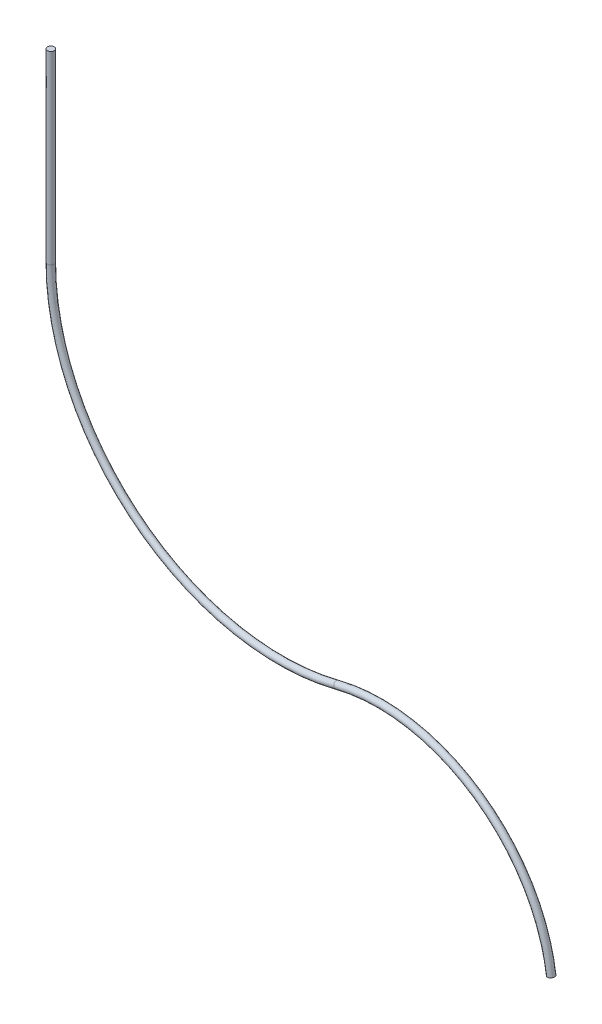
ISO-10303-21;
HEADER;
FILE_DESCRIPTION(('STEP AP214'),'2;1');
FILE_NAME('part.step','',(''),(''),'','','');
FILE_SCHEMA(('AUTOMOTIVE_DESIGN { 1 0 10303 214 1 1 1 1 }'));
ENDSEC;
DATA;
#1=APPLICATION_CONTEXT('core data for automotive mechanical design processes');
#2=APPLICATION_PROTOCOL_DEFINITION('international standard','automotive_design',2000,#1);
#3=PRODUCT_CONTEXT('',#1,'mechanical');
#4=PRODUCT('Part','Part','',(#3));
#5=PRODUCT_RELATED_PRODUCT_CATEGORY('part','',(#4));
#6=PRODUCT_DEFINITION_FORMATION('','',#4);
#7=PRODUCT_DEFINITION_CONTEXT('part definition',#1,'design');
#8=PRODUCT_DEFINITION('design','',#6,#7);
#9=PRODUCT_DEFINITION_SHAPE('','',#8);
#10=(LENGTH_UNIT() NAMED_UNIT(*) SI_UNIT(.MILLI.,.METRE.));
#11=(NAMED_UNIT(*) PLANE_ANGLE_UNIT() SI_UNIT($,.RADIAN.));
#12=(NAMED_UNIT(*) SI_UNIT($,.STERADIAN.) SOLID_ANGLE_UNIT());
#13=UNCERTAINTY_MEASURE_WITH_UNIT(LENGTH_MEASURE(1.E-05),#10,'distance_accuracy_value','');
#14=(GEOMETRIC_REPRESENTATION_CONTEXT(3) GLOBAL_UNCERTAINTY_ASSIGNED_CONTEXT((#13)) GLOBAL_UNIT_ASSIGNED_CONTEXT((#10,
#11,#12)) REPRESENTATION_CONTEXT('',''));
#15=CARTESIAN_POINT('',(0.,0.,0.));
#16=DIRECTION('',(0.,0.,1.));
#17=DIRECTION('',(1.,0.,0.));
#18=AXIS2_PLACEMENT_3D('',#15,#16,#17);
#19=CARTESIAN_POINT('',(-1.11022302462516E-13,-2.22044604925031E-13,0.));
#20=DIRECTION('',(0.,1.,0.));
#21=DIRECTION('',(-1.,0.,0.));
#22=AXIS2_PLACEMENT_3D('',#19,#20,#21);
#23=PLANE('',#22);
#24=CARTESIAN_POINT('',(-1.11022302462516E-13,-2.22044604925031E-13,0.));
#25=DIRECTION('',(0.,1.,0.));
#26=DIRECTION('',(-1.,0.,0.));
#27=AXIS2_PLACEMENT_3D('',#24,#25,#26);
#28=CIRCLE('',#27,3.99999999999998);
#29=CARTESIAN_POINT('',(-4.00000000000009,-2.17714735128993E-13,0.));
#30=VERTEX_POINT('',#29);
#31=EDGE_CURVE('E67',#30,#30,#28,.T.);
#32=ORIENTED_EDGE('',*,*,#31,.T.);
#33=EDGE_LOOP('',(#32));
#34=FACE_BOUND('',#33,.T.);
#35=ADVANCED_FACE('F53',(#34),#23,.T.);
#36=CARTESIAN_POINT('',(592.49344257651,-654.132093429297,0.));
#37=DIRECTION('',(-0.131093503958333,0.991370008230997,0.));
#38=DIRECTION('',(-0.991370008230997,-0.131093503958333,0.));
#39=AXIS2_PLACEMENT_3D('',#36,#37,#38);
#40=PLANE('',#39);
#41=CARTESIAN_POINT('',(592.49344257651,-654.132093429297,0.));
#42=DIRECTION('',(-0.131093503958333,0.991370008230997,0.));
#43=DIRECTION('',(-0.991370008230997,-0.131093503958333,0.));
#44=AXIS2_PLACEMENT_3D('',#41,#42,#43);
#45=CIRCLE('',#44,3.99999999999998);
#46=CARTESIAN_POINT('',(588.527962543586,-654.65646744513,0.));
#47=VERTEX_POINT('',#46);
#48=EDGE_CURVE('E11',#47,#47,#45,.T.);
#49=ORIENTED_EDGE('',*,*,#48,.F.);
#50=EDGE_LOOP('',(#49));
#51=FACE_BOUND('',#50,.T.);
#52=ADVANCED_FACE('F77',(#51),#40,.F.);
#53=CARTESIAN_POINT('',(-1.11022302462516E-13,-2.22044604925031E-13,0.));
#54=DIRECTION('',(0.,-1.,0.));
#55=DIRECTION('',(0.,0.,-1.));
#56=AXIS2_PLACEMENT_3D('',#53,#54,#55);
#57=CYLINDRICAL_SURFACE('',#56,3.99999999999998);
#58=CARTESIAN_POINT('',(-1.11022302462516E-13,-218.908393302911,0.));
#59=DIRECTION('',(0.,1.,0.));
#60=DIRECTION('',(-1.,0.,0.));
#61=AXIS2_PLACEMENT_3D('',#58,#59,#60);
#62=CIRCLE('',#61,3.99999999999998);
#63=CARTESIAN_POINT('',(-4.00000000000011,-218.908393302911,0.));
#64=VERTEX_POINT('',#63);
#65=EDGE_CURVE('E63',#64,#64,#62,.T.);
#66=ORIENTED_EDGE('',*,*,#65,.T.);
#67=EDGE_LOOP('',(#66));
#68=FACE_BOUND('',#67,.T.);
#69=ORIENTED_EDGE('',*,*,#31,.F.);
#70=EDGE_LOOP('',(#69));
#71=FACE_BOUND('',#70,.T.);
#72=ADVANCED_FACE('F74',(#68,#71),#57,.T.);
#73=CARTESIAN_POINT('',(272.105337274907,-218.908393302911,0.));
#74=DIRECTION('',(0.,0.,1.));
#75=DIRECTION('',(1.,0.,0.));
#76=AXIS2_PLACEMENT_3D('',#73,#74,#75);
#77=TOROIDAL_SURFACE('',#76,272.105337274907,3.99999999999998);
#78=CARTESIAN_POINT('',(339.167787571625,-482.62024804913,0.));
#79=DIRECTION('',(-0.969153554234743,-0.246457680574506,0.));
#80=DIRECTION('',(0.246457680574506,-0.969153554234743,0.));
#81=AXIS2_PLACEMENT_3D('',#78,#79,#80);
#82=CIRCLE('',#81,3.99999999999998);
#83=CARTESIAN_POINT('',(340.153618293923,-486.496862266069,0.));
#84=VERTEX_POINT('',#83);
#85=EDGE_CURVE('E59',#84,#84,#82,.T.);
#86=CARTESIAN_POINT('',(272.105337274907,-218.908393302911,0.));
#87=DIRECTION('',(0.,0.,1.));
#88=DIRECTION('',(1.,0.,0.));
#89=AXIS2_PLACEMENT_3D('',#86,#87,#88);
#90=CIRCLE('',#89,276.105337274907);
#91=EDGE_CURVE('',#64,#84,#90,.T.);
#92=ORIENTED_EDGE('',*,*,#65,.F.);
#93=ORIENTED_EDGE('',*,*,#85,.T.);
#94=ORIENTED_EDGE('',*,*,#91,.T.);
#95=ORIENTED_EDGE('',*,*,#91,.F.);
#96=EDGE_LOOP('',(#92,#94,#93,#95));
#97=FACE_BOUND('',#96,.T.);
#98=ADVANCED_FACE('F76',(#97),#77,.T.);
#99=CARTESIAN_POINT('',(389.606191823811,-680.960825778286,0.));
#100=DIRECTION('',(0.,0.,-1.));
#101=DIRECTION('',(-1.,0.,0.));
#102=AXIS2_PLACEMENT_3D('',#99,#100,#101);
#103=TOROIDAL_SURFACE('',#102,204.653407979057,3.99999999999998);
#104=ORIENTED_EDGE('',*,*,#48,.T.);
#105=EDGE_LOOP('',(#104));
#106=FACE_BOUND('',#105,.T.);
#107=ORIENTED_EDGE('',*,*,#85,.F.);
#108=EDGE_LOOP('',(#107));
#109=FACE_BOUND('',#108,.T.);
#110=ADVANCED_FACE('F84',(#106,#109),#103,.T.);
#111=CLOSED_SHELL('',(#35,#52,#72,#98,#110));
#112=MANIFOLD_SOLID_BREP('B2',#111);
#113=ADVANCED_BREP_SHAPE_REPRESENTATION('',(#18,#112),#14);
#114=SHAPE_DEFINITION_REPRESENTATION(#9,#113);
ENDSEC;
END-ISO-10303-21;
